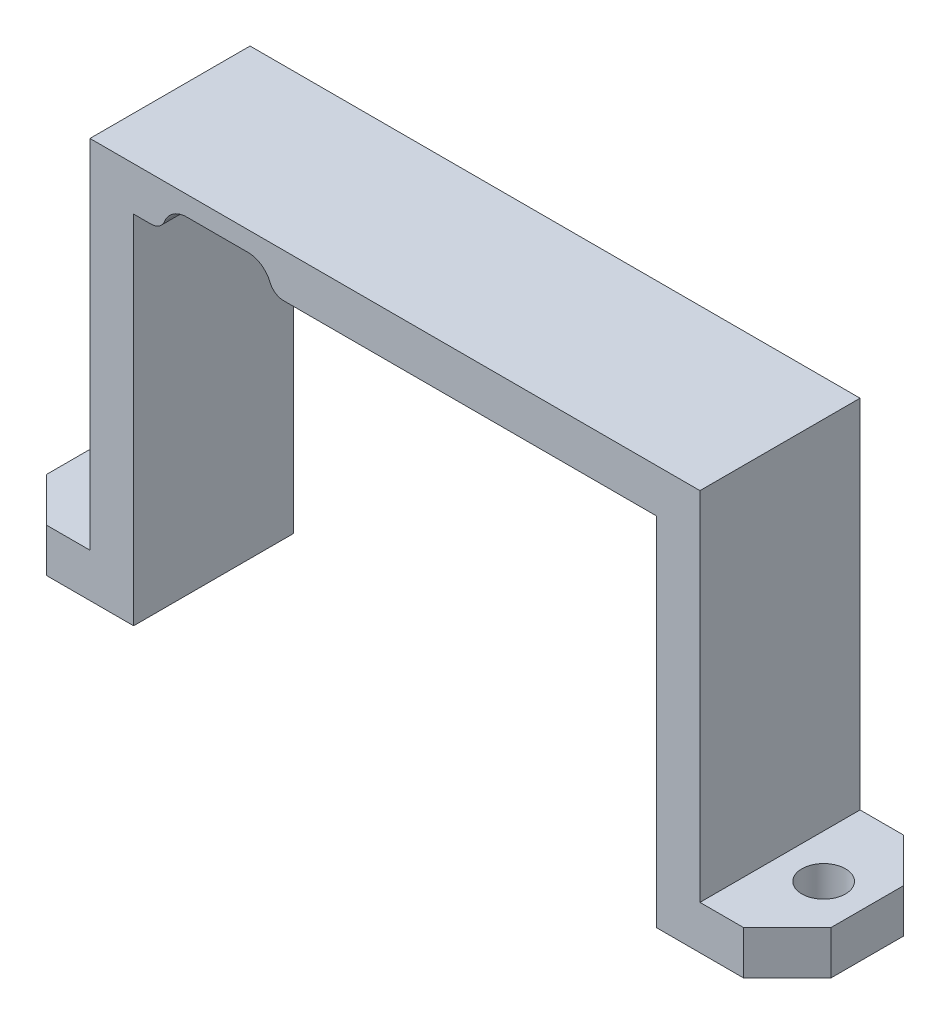
ISO-10303-21;
HEADER;
FILE_DESCRIPTION(('STEP AP214'),'2;1');
FILE_NAME('part.step','',(''),(''),'','','');
FILE_SCHEMA(('AUTOMOTIVE_DESIGN { 1 0 10303 214 1 1 1 1 }'));
ENDSEC;
DATA;
#1=APPLICATION_CONTEXT('core data for automotive mechanical design processes');
#2=APPLICATION_PROTOCOL_DEFINITION('international standard','automotive_design',2000,#1);
#3=PRODUCT_CONTEXT('',#1,'mechanical');
#4=PRODUCT('Part','Part','',(#3));
#5=PRODUCT_RELATED_PRODUCT_CATEGORY('part','',(#4));
#6=PRODUCT_DEFINITION_FORMATION('','',#4);
#7=PRODUCT_DEFINITION_CONTEXT('part definition',#1,'design');
#8=PRODUCT_DEFINITION('design','',#6,#7);
#9=PRODUCT_DEFINITION_SHAPE('','',#8);
#10=(LENGTH_UNIT() NAMED_UNIT(*) SI_UNIT(.MILLI.,.METRE.));
#11=(NAMED_UNIT(*) PLANE_ANGLE_UNIT() SI_UNIT($,.RADIAN.));
#12=(NAMED_UNIT(*) SI_UNIT($,.STERADIAN.) SOLID_ANGLE_UNIT());
#13=UNCERTAINTY_MEASURE_WITH_UNIT(LENGTH_MEASURE(1.E-05),#10,'distance_accuracy_value','');
#14=(GEOMETRIC_REPRESENTATION_CONTEXT(3) GLOBAL_UNCERTAINTY_ASSIGNED_CONTEXT((#13)) GLOBAL_UNIT_ASSIGNED_CONTEXT((#10,
#11,#12)) REPRESENTATION_CONTEXT('',''));
#15=CARTESIAN_POINT('',(0.,0.,0.));
#16=DIRECTION('',(0.,0.,1.));
#17=DIRECTION('',(1.,0.,0.));
#18=AXIS2_PLACEMENT_3D('',#15,#16,#17);
#19=CARTESIAN_POINT('',(-17.955,24.5,11.));
#20=DIRECTION('',(0.,1.,0.));
#21=DIRECTION('',(0.,0.,1.));
#22=AXIS2_PLACEMENT_3D('',#19,#20,#21);
#23=PLANE('',#22);
#24=DIRECTION('',(1.,0.,0.));
#25=VECTOR('',#24,1.);
#26=CARTESIAN_POINT('',(-17.955,24.5,0.));
#27=LINE('',#26,#25);
#28=CARTESIAN_POINT('',(-17.955,24.5,0.));
#29=VERTEX_POINT('',#28);
#30=CARTESIAN_POINT('',(-16.7590782383616,24.5,0.));
#31=VERTEX_POINT('',#30);
#32=EDGE_CURVE('E270',#29,#31,#27,.T.);
#33=ORIENTED_EDGE('',*,*,#32,.T.);
#34=DIRECTION('',(0.,0.,1.));
#35=VECTOR('',#34,1.);
#36=CARTESIAN_POINT('',(-16.7590782383616,24.5,11.));
#37=LINE('',#36,#35);
#38=CARTESIAN_POINT('',(-16.7590782383616,24.5,11.));
#39=VERTEX_POINT('',#38);
#40=EDGE_CURVE('E47',#31,#39,#37,.T.);
#41=ORIENTED_EDGE('',*,*,#40,.T.);
#42=DIRECTION('',(1.,0.,0.));
#43=VECTOR('',#42,1.);
#44=CARTESIAN_POINT('',(-17.955,24.5,11.));
#45=LINE('',#44,#43);
#46=CARTESIAN_POINT('',(-17.955,24.5,11.));
#47=VERTEX_POINT('',#46);
#48=EDGE_CURVE('E244',#47,#39,#45,.T.);
#49=ORIENTED_EDGE('',*,*,#48,.F.);
#50=DIRECTION('',(0.,0.,-1.));
#51=VECTOR('',#50,1.);
#52=CARTESIAN_POINT('',(-17.955,24.5,11.));
#53=LINE('',#52,#51);
#54=EDGE_CURVE('E317',#47,#29,#53,.T.);
#55=ORIENTED_EDGE('',*,*,#54,.T.);
#56=EDGE_LOOP('',(#33,#41,#49,#55));
#57=FACE_BOUND('',#56,.T.);
#58=ADVANCED_FACE('F41',(#57),#23,.F.);
#59=CARTESIAN_POINT('',(0.,0.,11.));
#60=DIRECTION('',(0.,0.,-1.));
#61=DIRECTION('',(-1.,0.,0.));
#62=AXIS2_PLACEMENT_3D('',#59,#60,#61);
#63=PLANE('',#62);
#64=CARTESIAN_POINT('',(-10.105,24.5,11.));
#65=DIRECTION('',(0.,0.,1.));
#66=DIRECTION('',(1.,0.,0.));
#67=AXIS2_PLACEMENT_3D('',#64,#65,#66);
#68=CIRCLE('',#67,1.65);
#69=CARTESIAN_POINT('',(-8.5769890213975,25.122641509434,11.));
#70=VERTEX_POINT('',#69);
#71=CARTESIAN_POINT('',(-10.105,26.15,11.));
#72=VERTEX_POINT('',#71);
#73=EDGE_CURVE('E210',#70,#72,#68,.T.);
#74=ORIENTED_EDGE('',*,*,#73,.F.);
#75=CARTESIAN_POINT('',(-7.6509217616384,25.5,11.));
#76=DIRECTION('',(0.,0.,-1.));
#77=DIRECTION('',(-1.,0.,0.));
#78=AXIS2_PLACEMENT_3D('',#75,#76,#77);
#79=CIRCLE('',#78,1.);
#80=CARTESIAN_POINT('',(-7.6509217616384,24.5,11.));
#81=VERTEX_POINT('',#80);
#82=EDGE_CURVE('E364',#70,#81,#79,.F.);
#83=ORIENTED_EDGE('',*,*,#82,.T.);
#84=CARTESIAN_POINT('',(17.955,24.5,11.));
#85=VERTEX_POINT('',#84);
#86=EDGE_CURVE('E241',#81,#85,#45,.T.);
#87=ORIENTED_EDGE('',*,*,#86,.T.);
#88=DIRECTION('',(0.,-1.,0.));
#89=VECTOR('',#88,1.);
#90=CARTESIAN_POINT('',(17.955,0.,11.));
#91=LINE('',#90,#89);
#92=CARTESIAN_POINT('',(17.955,0.,11.));
#93=VERTEX_POINT('',#92);
#94=EDGE_CURVE('E245',#85,#93,#91,.T.);
#95=ORIENTED_EDGE('',*,*,#94,.T.);
#96=DIRECTION('',(1.,0.,0.));
#97=VECTOR('',#96,1.);
#98=CARTESIAN_POINT('',(26.955,0.,11.));
#99=LINE('',#98,#97);
#100=CARTESIAN_POINT('',(23.955,0.,11.));
#101=VERTEX_POINT('',#100);
#102=EDGE_CURVE('E250',#93,#101,#99,.T.);
#103=ORIENTED_EDGE('',*,*,#102,.T.);
#104=DIRECTION('',(0.,1.,0.));
#105=VECTOR('',#104,1.);
#106=CARTESIAN_POINT('',(23.955,0.,11.));
#107=LINE('',#106,#105);
#108=CARTESIAN_POINT('',(23.955,3.,11.));
#109=VERTEX_POINT('',#108);
#110=EDGE_CURVE('E345',#101,#109,#107,.T.);
#111=ORIENTED_EDGE('',*,*,#110,.T.);
#112=DIRECTION('',(-1.,0.,0.));
#113=VECTOR('',#112,1.);
#114=CARTESIAN_POINT('',(20.955,3.,11.));
#115=LINE('',#114,#113);
#116=CARTESIAN_POINT('',(20.955,3.,11.));
#117=VERTEX_POINT('',#116);
#118=EDGE_CURVE('E246',#109,#117,#115,.T.);
#119=ORIENTED_EDGE('',*,*,#118,.T.);
#120=DIRECTION('',(0.,1.,0.));
#121=VECTOR('',#120,1.);
#122=CARTESIAN_POINT('',(20.955,27.5,11.));
#123=LINE('',#122,#121);
#124=CARTESIAN_POINT('',(20.955,27.5,11.));
#125=VERTEX_POINT('',#124);
#126=EDGE_CURVE('E252',#117,#125,#123,.T.);
#127=ORIENTED_EDGE('',*,*,#126,.T.);
#128=DIRECTION('',(-1.,0.,0.));
#129=VECTOR('',#128,1.);
#130=CARTESIAN_POINT('',(20.955,27.5,11.));
#131=LINE('',#130,#129);
#132=CARTESIAN_POINT('',(-20.955,27.5,11.));
#133=VERTEX_POINT('',#132);
#134=EDGE_CURVE('E255',#125,#133,#131,.T.);
#135=ORIENTED_EDGE('',*,*,#134,.T.);
#136=DIRECTION('',(0.,-1.,0.));
#137=VECTOR('',#136,1.);
#138=CARTESIAN_POINT('',(-20.955,27.5,11.));
#139=LINE('',#138,#137);
#140=CARTESIAN_POINT('',(-20.955,3.,11.));
#141=VERTEX_POINT('',#140);
#142=EDGE_CURVE('E258',#133,#141,#139,.T.);
#143=ORIENTED_EDGE('',*,*,#142,.T.);
#144=DIRECTION('',(-1.,0.,0.));
#145=VECTOR('',#144,1.);
#146=CARTESIAN_POINT('',(-20.955,3.,11.));
#147=LINE('',#146,#145);
#148=CARTESIAN_POINT('',(-23.955,3.,11.));
#149=VERTEX_POINT('',#148);
#150=EDGE_CURVE('E256',#141,#149,#147,.T.);
#151=ORIENTED_EDGE('',*,*,#150,.T.);
#152=DIRECTION('',(0.,-1.,0.));
#153=VECTOR('',#152,1.);
#154=CARTESIAN_POINT('',(-23.955,0.,11.));
#155=LINE('',#154,#153);
#156=CARTESIAN_POINT('',(-23.955,0.,11.));
#157=VERTEX_POINT('',#156);
#158=EDGE_CURVE('E338',#149,#157,#155,.T.);
#159=ORIENTED_EDGE('',*,*,#158,.T.);
#160=DIRECTION('',(1.,0.,0.));
#161=VECTOR('',#160,1.);
#162=CARTESIAN_POINT('',(-26.955,0.,11.));
#163=LINE('',#162,#161);
#164=CARTESIAN_POINT('',(-17.955,0.,11.));
#165=VERTEX_POINT('',#164);
#166=EDGE_CURVE('E261',#157,#165,#163,.T.);
#167=ORIENTED_EDGE('',*,*,#166,.T.);
#168=DIRECTION('',(0.,1.,0.));
#169=VECTOR('',#168,1.);
#170=CARTESIAN_POINT('',(-17.955,0.,11.));
#171=LINE('',#170,#169);
#172=EDGE_CURVE('E236',#165,#47,#171,.T.);
#173=ORIENTED_EDGE('',*,*,#172,.T.);
#174=ORIENTED_EDGE('',*,*,#48,.T.);
#175=CARTESIAN_POINT('',(-16.7590782383616,25.5,11.));
#176=DIRECTION('',(0.,0.,-1.));
#177=DIRECTION('',(-1.,0.,0.));
#178=AXIS2_PLACEMENT_3D('',#175,#176,#177);
#179=CIRCLE('',#178,1.);
#180=CARTESIAN_POINT('',(-15.8330109786025,25.122641509434,11.));
#181=VERTEX_POINT('',#180);
#182=EDGE_CURVE('E57',#39,#181,#179,.F.);
#183=ORIENTED_EDGE('',*,*,#182,.T.);
#184=CARTESIAN_POINT('',(-14.305,24.5,11.));
#185=DIRECTION('',(0.,0.,1.));
#186=DIRECTION('',(1.,0.,0.));
#187=AXIS2_PLACEMENT_3D('',#184,#185,#186);
#188=CIRCLE('',#187,1.65);
#189=CARTESIAN_POINT('',(-14.305,26.15,11.));
#190=VERTEX_POINT('',#189);
#191=EDGE_CURVE('E219',#190,#181,#188,.T.);
#192=ORIENTED_EDGE('',*,*,#191,.F.);
#193=DIRECTION('',(-1.,0.,0.));
#194=VECTOR('',#193,1.);
#195=CARTESIAN_POINT('',(-14.305,26.15,11.));
#196=LINE('',#195,#194);
#197=EDGE_CURVE('E220',#72,#190,#196,.T.);
#198=ORIENTED_EDGE('',*,*,#197,.F.);
#199=EDGE_LOOP('',(#74,#83,#87,#95,#103,#111,#119,#127,#135,#143,#151,#159,#167,#173,#174,#183,
#192,#198));
#200=FACE_BOUND('',#199,.T.);
#201=ADVANCED_FACE('F366',(#200),#63,.F.);
#202=CARTESIAN_POINT('',(0.,0.,0.));
#203=DIRECTION('',(0.,0.,-1.));
#204=DIRECTION('',(-1.,0.,0.));
#205=AXIS2_PLACEMENT_3D('',#202,#203,#204);
#206=PLANE('',#205);
#207=CARTESIAN_POINT('',(-7.6509217616384,24.5,0.));
#208=VERTEX_POINT('',#207);
#209=CARTESIAN_POINT('',(17.955,24.5,0.));
#210=VERTEX_POINT('',#209);
#211=EDGE_CURVE('E266',#208,#210,#27,.T.);
#212=ORIENTED_EDGE('',*,*,#211,.F.);
#213=CARTESIAN_POINT('',(-7.6509217616384,25.5,0.));
#214=DIRECTION('',(0.,0.,-1.));
#215=DIRECTION('',(-1.,0.,0.));
#216=AXIS2_PLACEMENT_3D('',#213,#214,#215);
#217=CIRCLE('',#216,1.);
#218=CARTESIAN_POINT('',(-8.5769890213975,25.122641509434,0.));
#219=VERTEX_POINT('',#218);
#220=EDGE_CURVE('E197',#208,#219,#217,.T.);
#221=ORIENTED_EDGE('',*,*,#220,.T.);
#222=CARTESIAN_POINT('',(-10.105,24.5,0.));
#223=DIRECTION('',(0.,0.,1.));
#224=DIRECTION('',(1.,0.,0.));
#225=AXIS2_PLACEMENT_3D('',#222,#223,#224);
#226=CIRCLE('',#225,1.65);
#227=CARTESIAN_POINT('',(-10.105,26.15,0.));
#228=VERTEX_POINT('',#227);
#229=EDGE_CURVE('E190',#219,#228,#226,.T.);
#230=ORIENTED_EDGE('',*,*,#229,.T.);
#231=DIRECTION('',(-1.,0.,0.));
#232=VECTOR('',#231,1.);
#233=CARTESIAN_POINT('',(-14.305,26.15,0.));
#234=LINE('',#233,#232);
#235=CARTESIAN_POINT('',(-14.305,26.15,0.));
#236=VERTEX_POINT('',#235);
#237=EDGE_CURVE('E198',#228,#236,#234,.T.);
#238=ORIENTED_EDGE('',*,*,#237,.T.);
#239=CARTESIAN_POINT('',(-14.305,24.5,0.));
#240=DIRECTION('',(0.,0.,1.));
#241=DIRECTION('',(1.,0.,0.));
#242=AXIS2_PLACEMENT_3D('',#239,#240,#241);
#243=CIRCLE('',#242,1.65);
#244=CARTESIAN_POINT('',(-15.8330109786025,25.122641509434,0.));
#245=VERTEX_POINT('',#244);
#246=EDGE_CURVE('E214',#236,#245,#243,.T.);
#247=ORIENTED_EDGE('',*,*,#246,.T.);
#248=CARTESIAN_POINT('',(-16.7590782383616,25.5,0.));
#249=DIRECTION('',(0.,0.,-1.));
#250=DIRECTION('',(-1.,0.,0.));
#251=AXIS2_PLACEMENT_3D('',#248,#249,#250);
#252=CIRCLE('',#251,1.);
#253=EDGE_CURVE('E359',#245,#31,#252,.T.);
#254=ORIENTED_EDGE('',*,*,#253,.T.);
#255=ORIENTED_EDGE('',*,*,#32,.F.);
#256=DIRECTION('',(0.,1.,0.));
#257=VECTOR('',#256,1.);
#258=CARTESIAN_POINT('',(-17.955,0.,0.));
#259=LINE('',#258,#257);
#260=CARTESIAN_POINT('',(-17.955,0.,0.));
#261=VERTEX_POINT('',#260);
#262=EDGE_CURVE('E228',#261,#29,#259,.T.);
#263=ORIENTED_EDGE('',*,*,#262,.F.);
#264=DIRECTION('',(1.,0.,0.));
#265=VECTOR('',#264,1.);
#266=CARTESIAN_POINT('',(-26.955,0.,0.));
#267=LINE('',#266,#265);
#268=CARTESIAN_POINT('',(-23.955,0.,0.));
#269=VERTEX_POINT('',#268);
#270=EDGE_CURVE('E242',#269,#261,#267,.T.);
#271=ORIENTED_EDGE('',*,*,#270,.F.);
#272=DIRECTION('',(0.,1.,0.));
#273=VECTOR('',#272,1.);
#274=CARTESIAN_POINT('',(-23.955,3.,0.));
#275=LINE('',#274,#273);
#276=CARTESIAN_POINT('',(-23.955,3.,0.));
#277=VERTEX_POINT('',#276);
#278=EDGE_CURVE('E332',#269,#277,#275,.T.);
#279=ORIENTED_EDGE('',*,*,#278,.T.);
#280=DIRECTION('',(-1.,0.,0.));
#281=VECTOR('',#280,1.);
#282=CARTESIAN_POINT('',(-20.955,3.,0.));
#283=LINE('',#282,#281);
#284=CARTESIAN_POINT('',(-20.955,3.,0.));
#285=VERTEX_POINT('',#284);
#286=EDGE_CURVE('E284',#285,#277,#283,.T.);
#287=ORIENTED_EDGE('',*,*,#286,.F.);
#288=DIRECTION('',(0.,-1.,0.));
#289=VECTOR('',#288,1.);
#290=CARTESIAN_POINT('',(-20.955,27.5,0.));
#291=LINE('',#290,#289);
#292=CARTESIAN_POINT('',(-20.955,27.5,0.));
#293=VERTEX_POINT('',#292);
#294=EDGE_CURVE('E281',#293,#285,#291,.T.);
#295=ORIENTED_EDGE('',*,*,#294,.F.);
#296=DIRECTION('',(-1.,0.,0.));
#297=VECTOR('',#296,1.);
#298=CARTESIAN_POINT('',(20.955,27.5,0.));
#299=LINE('',#298,#297);
#300=CARTESIAN_POINT('',(20.955,27.5,0.));
#301=VERTEX_POINT('',#300);
#302=EDGE_CURVE('E276',#301,#293,#299,.T.);
#303=ORIENTED_EDGE('',*,*,#302,.F.);
#304=DIRECTION('',(0.,1.,0.));
#305=VECTOR('',#304,1.);
#306=CARTESIAN_POINT('',(20.955,27.5,0.));
#307=LINE('',#306,#305);
#308=CARTESIAN_POINT('',(20.955,3.,0.));
#309=VERTEX_POINT('',#308);
#310=EDGE_CURVE('E280',#309,#301,#307,.T.);
#311=ORIENTED_EDGE('',*,*,#310,.F.);
#312=DIRECTION('',(-1.,0.,0.));
#313=VECTOR('',#312,1.);
#314=CARTESIAN_POINT('',(20.955,3.,0.));
#315=LINE('',#314,#313);
#316=CARTESIAN_POINT('',(23.955,3.,0.));
#317=VERTEX_POINT('',#316);
#318=EDGE_CURVE('E274',#317,#309,#315,.T.);
#319=ORIENTED_EDGE('',*,*,#318,.F.);
#320=DIRECTION('',(0.,-1.,0.));
#321=VECTOR('',#320,1.);
#322=CARTESIAN_POINT('',(23.955,0.,0.));
#323=LINE('',#322,#321);
#324=CARTESIAN_POINT('',(23.955,0.,0.));
#325=VERTEX_POINT('',#324);
#326=EDGE_CURVE('E334',#317,#325,#323,.T.);
#327=ORIENTED_EDGE('',*,*,#326,.T.);
#328=DIRECTION('',(1.,0.,0.));
#329=VECTOR('',#328,1.);
#330=CARTESIAN_POINT('',(26.955,0.,0.));
#331=LINE('',#330,#329);
#332=CARTESIAN_POINT('',(17.955,0.,0.));
#333=VERTEX_POINT('',#332);
#334=EDGE_CURVE('E275',#333,#325,#331,.T.);
#335=ORIENTED_EDGE('',*,*,#334,.F.);
#336=DIRECTION('',(0.,-1.,0.));
#337=VECTOR('',#336,1.);
#338=CARTESIAN_POINT('',(17.955,0.,0.));
#339=LINE('',#338,#337);
#340=EDGE_CURVE('E269',#210,#333,#339,.T.);
#341=ORIENTED_EDGE('',*,*,#340,.F.);
#342=EDGE_LOOP('',(#212,#221,#230,#238,#247,#254,#255,#263,#271,#279,#287,#295,#303,#311,#319,
#327,#335,#341));
#343=FACE_BOUND('',#342,.T.);
#344=ADVANCED_FACE('F193',(#343),#206,.T.);
#345=CARTESIAN_POINT('',(-17.955,0.,11.));
#346=DIRECTION('',(-1.,0.,0.));
#347=DIRECTION('',(0.,-1.,0.));
#348=AXIS2_PLACEMENT_3D('',#345,#346,#347);
#349=PLANE('',#348);
#350=ORIENTED_EDGE('',*,*,#262,.T.);
#351=ORIENTED_EDGE('',*,*,#54,.F.);
#352=ORIENTED_EDGE('',*,*,#172,.F.);
#353=DIRECTION('',(0.,0.,-1.));
#354=VECTOR('',#353,1.);
#355=CARTESIAN_POINT('',(-17.955,0.,11.));
#356=LINE('',#355,#354);
#357=EDGE_CURVE('E263',#165,#261,#356,.T.);
#358=ORIENTED_EDGE('',*,*,#357,.T.);
#359=EDGE_LOOP('',(#350,#351,#352,#358));
#360=FACE_BOUND('',#359,.T.);
#361=ADVANCED_FACE('F372',(#360),#349,.F.);
#362=ORIENTED_EDGE('',*,*,#86,.F.);
#363=DIRECTION('',(0.,0.,1.));
#364=VECTOR('',#363,1.);
#365=CARTESIAN_POINT('',(-7.6509217616384,24.5,11.));
#366=LINE('',#365,#364);
#367=EDGE_CURVE('E199',#81,#208,#366,.F.);
#368=ORIENTED_EDGE('',*,*,#367,.T.);
#369=ORIENTED_EDGE('',*,*,#211,.T.);
#370=DIRECTION('',(0.,0.,-1.));
#371=VECTOR('',#370,1.);
#372=CARTESIAN_POINT('',(17.955,24.5,11.));
#373=LINE('',#372,#371);
#374=EDGE_CURVE('E316',#85,#210,#373,.T.);
#375=ORIENTED_EDGE('',*,*,#374,.F.);
#376=EDGE_LOOP('',(#362,#368,#369,#375));
#377=FACE_BOUND('',#376,.T.);
#378=ADVANCED_FACE('F387',(#377),#23,.F.);
#379=CARTESIAN_POINT('',(17.955,0.,11.));
#380=DIRECTION('',(1.,0.,0.));
#381=DIRECTION('',(0.,1.,0.));
#382=AXIS2_PLACEMENT_3D('',#379,#380,#381);
#383=PLANE('',#382);
#384=ORIENTED_EDGE('',*,*,#340,.T.);
#385=DIRECTION('',(0.,0.,-1.));
#386=VECTOR('',#385,1.);
#387=CARTESIAN_POINT('',(17.955,0.,11.));
#388=LINE('',#387,#386);
#389=EDGE_CURVE('E311',#93,#333,#388,.T.);
#390=ORIENTED_EDGE('',*,*,#389,.F.);
#391=ORIENTED_EDGE('',*,*,#94,.F.);
#392=ORIENTED_EDGE('',*,*,#374,.T.);
#393=EDGE_LOOP('',(#384,#390,#391,#392));
#394=FACE_BOUND('',#393,.T.);
#395=ADVANCED_FACE('F392',(#394),#383,.F.);
#396=CARTESIAN_POINT('',(26.955,0.,11.));
#397=DIRECTION('',(0.,1.,0.));
#398=DIRECTION('',(0.,0.,1.));
#399=AXIS2_PLACEMENT_3D('',#396,#397,#398);
#400=PLANE('',#399);
#401=CARTESIAN_POINT('',(23.955,0.,5.5));
#402=DIRECTION('',(0.,1.,0.));
#403=DIRECTION('',(1.,0.,0.));
#404=AXIS2_PLACEMENT_3D('',#401,#402,#403);
#405=CIRCLE('',#404,1.5);
#406=CARTESIAN_POINT('',(25.455,0.,5.5));
#407=VERTEX_POINT('',#406);
#408=EDGE_CURVE('E221',#407,#407,#405,.T.);
#409=ORIENTED_EDGE('',*,*,#408,.T.);
#410=EDGE_LOOP('',(#409));
#411=FACE_BOUND('',#410,.T.);
#412=ORIENTED_EDGE('',*,*,#334,.T.);
#413=DIRECTION('',(0.707106781186548,0.,0.707106781186547));
#414=VECTOR('',#413,1.);
#415=CARTESIAN_POINT('',(26.955,0.,3.));
#416=LINE('',#415,#414);
#417=CARTESIAN_POINT('',(26.955,0.,3.));
#418=VERTEX_POINT('',#417);
#419=EDGE_CURVE('E337',#325,#418,#416,.T.);
#420=ORIENTED_EDGE('',*,*,#419,.T.);
#421=DIRECTION('',(0.,0.,-1.));
#422=VECTOR('',#421,1.);
#423=CARTESIAN_POINT('',(26.955,0.,11.));
#424=LINE('',#423,#422);
#425=CARTESIAN_POINT('',(26.955,0.,7.99999999999999));
#426=VERTEX_POINT('',#425);
#427=EDGE_CURVE('E309',#426,#418,#424,.T.);
#428=ORIENTED_EDGE('',*,*,#427,.F.);
#429=DIRECTION('',(0.707106781186547,0.,-0.707106781186548));
#430=VECTOR('',#429,1.);
#431=CARTESIAN_POINT('',(23.955,0.,11.));
#432=LINE('',#431,#430);
#433=EDGE_CURVE('E333',#426,#101,#432,.F.);
#434=ORIENTED_EDGE('',*,*,#433,.T.);
#435=ORIENTED_EDGE('',*,*,#102,.F.);
#436=ORIENTED_EDGE('',*,*,#389,.T.);
#437=EDGE_LOOP('',(#412,#420,#428,#434,#435,#436));
#438=FACE_BOUND('',#437,.T.);
#439=ADVANCED_FACE('F397',(#411,#438),#400,.F.);
#440=CARTESIAN_POINT('',(26.955,3.,11.));
#441=DIRECTION('',(-1.,0.,0.));
#442=DIRECTION('',(0.,0.,1.));
#443=AXIS2_PLACEMENT_3D('',#440,#441,#442);
#444=PLANE('',#443);
#445=ORIENTED_EDGE('',*,*,#427,.T.);
#446=DIRECTION('',(0.,1.,0.));
#447=VECTOR('',#446,1.);
#448=CARTESIAN_POINT('',(26.955,3.,3.));
#449=LINE('',#448,#447);
#450=CARTESIAN_POINT('',(26.955,3.,3.));
#451=VERTEX_POINT('',#450);
#452=EDGE_CURVE('E322',#418,#451,#449,.T.);
#453=ORIENTED_EDGE('',*,*,#452,.T.);
#454=DIRECTION('',(0.,0.,-1.));
#455=VECTOR('',#454,1.);
#456=CARTESIAN_POINT('',(26.955,3.,11.));
#457=LINE('',#456,#455);
#458=CARTESIAN_POINT('',(26.955,3.,7.99999999999999));
#459=VERTEX_POINT('',#458);
#460=EDGE_CURVE('E307',#459,#451,#457,.T.);
#461=ORIENTED_EDGE('',*,*,#460,.F.);
#462=DIRECTION('',(0.,-1.,0.));
#463=VECTOR('',#462,1.);
#464=CARTESIAN_POINT('',(26.955,3.,7.99999999999999));
#465=LINE('',#464,#463);
#466=EDGE_CURVE('E325',#459,#426,#465,.T.);
#467=ORIENTED_EDGE('',*,*,#466,.T.);
#468=EDGE_LOOP('',(#445,#453,#461,#467));
#469=FACE_BOUND('',#468,.T.);
#470=ADVANCED_FACE('F410',(#469),#444,.F.);
#471=CARTESIAN_POINT('',(20.955,3.,11.));
#472=DIRECTION('',(0.,-1.,0.));
#473=DIRECTION('',(1.,0.,0.));
#474=AXIS2_PLACEMENT_3D('',#471,#472,#473);
#475=PLANE('',#474);
#476=CARTESIAN_POINT('',(23.955,3.,5.5));
#477=DIRECTION('',(0.,1.,0.));
#478=DIRECTION('',(1.,0.,0.));
#479=AXIS2_PLACEMENT_3D('',#476,#477,#478);
#480=CIRCLE('',#479,1.5);
#481=CARTESIAN_POINT('',(25.455,3.,5.5));
#482=VERTEX_POINT('',#481);
#483=EDGE_CURVE('E233',#482,#482,#480,.T.);
#484=ORIENTED_EDGE('',*,*,#483,.F.);
#485=EDGE_LOOP('',(#484));
#486=FACE_BOUND('',#485,.T.);
#487=ORIENTED_EDGE('',*,*,#460,.T.);
#488=DIRECTION('',(-0.707106781186548,0.,-0.707106781186547));
#489=VECTOR('',#488,1.);
#490=CARTESIAN_POINT('',(26.955,3.,3.));
#491=LINE('',#490,#489);
#492=EDGE_CURVE('E328',#451,#317,#491,.T.);
#493=ORIENTED_EDGE('',*,*,#492,.T.);
#494=ORIENTED_EDGE('',*,*,#318,.T.);
#495=DIRECTION('',(0.,0.,-1.));
#496=VECTOR('',#495,1.);
#497=CARTESIAN_POINT('',(20.955,3.,11.));
#498=LINE('',#497,#496);
#499=EDGE_CURVE('E304',#117,#309,#498,.T.);
#500=ORIENTED_EDGE('',*,*,#499,.F.);
#501=ORIENTED_EDGE('',*,*,#118,.F.);
#502=DIRECTION('',(-0.707106781186547,0.,0.707106781186548));
#503=VECTOR('',#502,1.);
#504=CARTESIAN_POINT('',(23.955,3.,11.));
#505=LINE('',#504,#503);
#506=EDGE_CURVE('E330',#109,#459,#505,.F.);
#507=ORIENTED_EDGE('',*,*,#506,.T.);
#508=EDGE_LOOP('',(#487,#493,#494,#500,#501,#507));
#509=FACE_BOUND('',#508,.T.);
#510=ADVANCED_FACE('F407',(#486,#509),#475,.F.);
#511=CARTESIAN_POINT('',(20.955,27.5,11.));
#512=DIRECTION('',(-1.,0.,0.));
#513=DIRECTION('',(0.,-1.,0.));
#514=AXIS2_PLACEMENT_3D('',#511,#512,#513);
#515=PLANE('',#514);
#516=ORIENTED_EDGE('',*,*,#310,.T.);
#517=DIRECTION('',(0.,0.,-1.));
#518=VECTOR('',#517,1.);
#519=CARTESIAN_POINT('',(20.955,27.5,11.));
#520=LINE('',#519,#518);
#521=EDGE_CURVE('E302',#125,#301,#520,.T.);
#522=ORIENTED_EDGE('',*,*,#521,.F.);
#523=ORIENTED_EDGE('',*,*,#126,.F.);
#524=ORIENTED_EDGE('',*,*,#499,.T.);
#525=EDGE_LOOP('',(#516,#522,#523,#524));
#526=FACE_BOUND('',#525,.T.);
#527=ADVANCED_FACE('F423',(#526),#515,.F.);
#528=CARTESIAN_POINT('',(20.955,27.5,11.));
#529=DIRECTION('',(0.,-1.,0.));
#530=DIRECTION('',(0.,0.,-1.));
#531=AXIS2_PLACEMENT_3D('',#528,#529,#530);
#532=PLANE('',#531);
#533=ORIENTED_EDGE('',*,*,#302,.T.);
#534=DIRECTION('',(0.,0.,-1.));
#535=VECTOR('',#534,1.);
#536=CARTESIAN_POINT('',(-20.955,27.5,11.));
#537=LINE('',#536,#535);
#538=EDGE_CURVE('E299',#133,#293,#537,.T.);
#539=ORIENTED_EDGE('',*,*,#538,.F.);
#540=ORIENTED_EDGE('',*,*,#134,.F.);
#541=ORIENTED_EDGE('',*,*,#521,.T.);
#542=EDGE_LOOP('',(#533,#539,#540,#541));
#543=FACE_BOUND('',#542,.T.);
#544=ADVANCED_FACE('F422',(#543),#532,.F.);
#545=CARTESIAN_POINT('',(-20.955,27.5,11.));
#546=DIRECTION('',(1.,0.,0.));
#547=DIRECTION('',(0.,1.,0.));
#548=AXIS2_PLACEMENT_3D('',#545,#546,#547);
#549=PLANE('',#548);
#550=ORIENTED_EDGE('',*,*,#294,.T.);
#551=DIRECTION('',(0.,0.,-1.));
#552=VECTOR('',#551,1.);
#553=CARTESIAN_POINT('',(-20.955,3.,11.));
#554=LINE('',#553,#552);
#555=EDGE_CURVE('E293',#141,#285,#554,.T.);
#556=ORIENTED_EDGE('',*,*,#555,.F.);
#557=ORIENTED_EDGE('',*,*,#142,.F.);
#558=ORIENTED_EDGE('',*,*,#538,.T.);
#559=EDGE_LOOP('',(#550,#556,#557,#558));
#560=FACE_BOUND('',#559,.T.);
#561=ADVANCED_FACE('F435',(#560),#549,.F.);
#562=CARTESIAN_POINT('',(-20.955,3.,11.));
#563=DIRECTION('',(0.,-1.,0.));
#564=DIRECTION('',(1.,0.,0.));
#565=AXIS2_PLACEMENT_3D('',#562,#563,#564);
#566=PLANE('',#565);
#567=CARTESIAN_POINT('',(-23.955,3.,5.5));
#568=DIRECTION('',(0.,1.,0.));
#569=DIRECTION('',(-1.,0.,0.));
#570=AXIS2_PLACEMENT_3D('',#567,#568,#569);
#571=CIRCLE('',#570,1.5);
#572=CARTESIAN_POINT('',(-25.455,3.,5.5));
#573=VERTEX_POINT('',#572);
#574=EDGE_CURVE('E230',#573,#573,#571,.T.);
#575=ORIENTED_EDGE('',*,*,#574,.F.);
#576=EDGE_LOOP('',(#575));
#577=FACE_BOUND('',#576,.T.);
#578=ORIENTED_EDGE('',*,*,#286,.T.);
#579=DIRECTION('',(-0.707106781186548,0.,0.707106781186547));
#580=VECTOR('',#579,1.);
#581=CARTESIAN_POINT('',(-26.955,3.,3.));
#582=LINE('',#581,#580);
#583=CARTESIAN_POINT('',(-26.955,3.,3.));
#584=VERTEX_POINT('',#583);
#585=EDGE_CURVE('E203',#277,#584,#582,.T.);
#586=ORIENTED_EDGE('',*,*,#585,.T.);
#587=DIRECTION('',(0.,0.,-1.));
#588=VECTOR('',#587,1.);
#589=CARTESIAN_POINT('',(-26.955,3.,11.));
#590=LINE('',#589,#588);
#591=CARTESIAN_POINT('',(-26.955,3.,7.99999999999999));
#592=VERTEX_POINT('',#591);
#593=EDGE_CURVE('E295',#592,#584,#590,.T.);
#594=ORIENTED_EDGE('',*,*,#593,.F.);
#595=DIRECTION('',(-0.707106781186547,0.,-0.707106781186548));
#596=VECTOR('',#595,1.);
#597=CARTESIAN_POINT('',(-23.955,3.,11.));
#598=LINE('',#597,#596);
#599=EDGE_CURVE('E353',#592,#149,#598,.F.);
#600=ORIENTED_EDGE('',*,*,#599,.T.);
#601=ORIENTED_EDGE('',*,*,#150,.F.);
#602=ORIENTED_EDGE('',*,*,#555,.T.);
#603=EDGE_LOOP('',(#578,#586,#594,#600,#601,#602));
#604=FACE_BOUND('',#603,.T.);
#605=ADVANCED_FACE('F434',(#577,#604),#566,.F.);
#606=CARTESIAN_POINT('',(-26.955,3.,11.));
#607=DIRECTION('',(1.,0.,0.));
#608=DIRECTION('',(0.,0.,-1.));
#609=AXIS2_PLACEMENT_3D('',#606,#607,#608);
#610=PLANE('',#609);
#611=ORIENTED_EDGE('',*,*,#593,.T.);
#612=DIRECTION('',(0.,-1.,0.));
#613=VECTOR('',#612,1.);
#614=CARTESIAN_POINT('',(-26.955,0.,3.));
#615=LINE('',#614,#613);
#616=CARTESIAN_POINT('',(-26.955,0.,3.));
#617=VERTEX_POINT('',#616);
#618=EDGE_CURVE('E350',#584,#617,#615,.T.);
#619=ORIENTED_EDGE('',*,*,#618,.T.);
#620=DIRECTION('',(0.,0.,-1.));
#621=VECTOR('',#620,1.);
#622=CARTESIAN_POINT('',(-26.955,0.,11.));
#623=LINE('',#622,#621);
#624=CARTESIAN_POINT('',(-26.955,0.,7.99999999999999));
#625=VERTEX_POINT('',#624);
#626=EDGE_CURVE('E289',#625,#617,#623,.T.);
#627=ORIENTED_EDGE('',*,*,#626,.F.);
#628=DIRECTION('',(0.,1.,0.));
#629=VECTOR('',#628,1.);
#630=CARTESIAN_POINT('',(-26.955,3.,7.99999999999999));
#631=LINE('',#630,#629);
#632=EDGE_CURVE('E341',#625,#592,#631,.T.);
#633=ORIENTED_EDGE('',*,*,#632,.T.);
#634=EDGE_LOOP('',(#611,#619,#627,#633));
#635=FACE_BOUND('',#634,.T.);
#636=ADVANCED_FACE('F448',(#635),#610,.F.);
#637=CARTESIAN_POINT('',(-26.955,0.,11.));
#638=DIRECTION('',(0.,1.,0.));
#639=DIRECTION('',(0.,0.,1.));
#640=AXIS2_PLACEMENT_3D('',#637,#638,#639);
#641=PLANE('',#640);
#642=CARTESIAN_POINT('',(-23.955,0.,5.5));
#643=DIRECTION('',(0.,1.,0.));
#644=DIRECTION('',(-1.,0.,0.));
#645=AXIS2_PLACEMENT_3D('',#642,#643,#644);
#646=CIRCLE('',#645,1.5);
#647=CARTESIAN_POINT('',(-25.455,0.,5.5));
#648=VERTEX_POINT('',#647);
#649=EDGE_CURVE('E226',#648,#648,#646,.T.);
#650=ORIENTED_EDGE('',*,*,#649,.T.);
#651=EDGE_LOOP('',(#650));
#652=FACE_BOUND('',#651,.T.);
#653=ORIENTED_EDGE('',*,*,#626,.T.);
#654=DIRECTION('',(0.707106781186548,0.,-0.707106781186547));
#655=VECTOR('',#654,1.);
#656=CARTESIAN_POINT('',(-26.955,0.,3.));
#657=LINE('',#656,#655);
#658=EDGE_CURVE('E352',#617,#269,#657,.T.);
#659=ORIENTED_EDGE('',*,*,#658,.T.);
#660=ORIENTED_EDGE('',*,*,#270,.T.);
#661=ORIENTED_EDGE('',*,*,#357,.F.);
#662=ORIENTED_EDGE('',*,*,#166,.F.);
#663=DIRECTION('',(0.707106781186547,0.,0.707106781186548));
#664=VECTOR('',#663,1.);
#665=CARTESIAN_POINT('',(-23.955,0.,11.));
#666=LINE('',#665,#664);
#667=EDGE_CURVE('E348',#157,#625,#666,.F.);
#668=ORIENTED_EDGE('',*,*,#667,.T.);
#669=EDGE_LOOP('',(#653,#659,#660,#661,#662,#668));
#670=FACE_BOUND('',#669,.T.);
#671=ADVANCED_FACE('F445',(#652,#670),#641,.F.);
#672=CARTESIAN_POINT('',(26.955,3.,3.));
#673=DIRECTION('',(0.707106781186547,0.,-0.707106781186548));
#674=DIRECTION('',(0.,-1.,0.));
#675=AXIS2_PLACEMENT_3D('',#672,#673,#674);
#676=PLANE('',#675);
#677=ORIENTED_EDGE('',*,*,#419,.F.);
#678=ORIENTED_EDGE('',*,*,#326,.F.);
#679=ORIENTED_EDGE('',*,*,#492,.F.);
#680=ORIENTED_EDGE('',*,*,#452,.F.);
#681=EDGE_LOOP('',(#677,#678,#679,#680));
#682=FACE_BOUND('',#681,.T.);
#683=ADVANCED_FACE('F413',(#682),#676,.T.);
#684=CARTESIAN_POINT('',(23.955,0.,11.));
#685=DIRECTION('',(-0.707106781186548,0.,-0.707106781186547));
#686=DIRECTION('',(0.,1.,0.));
#687=AXIS2_PLACEMENT_3D('',#684,#685,#686);
#688=PLANE('',#687);
#689=ORIENTED_EDGE('',*,*,#433,.F.);
#690=ORIENTED_EDGE('',*,*,#466,.F.);
#691=ORIENTED_EDGE('',*,*,#506,.F.);
#692=ORIENTED_EDGE('',*,*,#110,.F.);
#693=EDGE_LOOP('',(#689,#690,#691,#692));
#694=FACE_BOUND('',#693,.T.);
#695=ADVANCED_FACE('F401',(#694),#688,.F.);
#696=CARTESIAN_POINT('',(-26.955,3.,3.));
#697=DIRECTION('',(-0.707106781186547,0.,-0.707106781186548));
#698=DIRECTION('',(0.,1.,0.));
#699=AXIS2_PLACEMENT_3D('',#696,#697,#698);
#700=PLANE('',#699);
#701=ORIENTED_EDGE('',*,*,#585,.F.);
#702=ORIENTED_EDGE('',*,*,#278,.F.);
#703=ORIENTED_EDGE('',*,*,#658,.F.);
#704=ORIENTED_EDGE('',*,*,#618,.F.);
#705=EDGE_LOOP('',(#701,#702,#703,#704));
#706=FACE_BOUND('',#705,.T.);
#707=ADVANCED_FACE('F447',(#706),#700,.T.);
#708=CARTESIAN_POINT('',(-23.955,0.,11.));
#709=DIRECTION('',(0.707106781186548,0.,-0.707106781186547));
#710=DIRECTION('',(0.,-1.,0.));
#711=AXIS2_PLACEMENT_3D('',#708,#709,#710);
#712=PLANE('',#711);
#713=ORIENTED_EDGE('',*,*,#599,.F.);
#714=ORIENTED_EDGE('',*,*,#632,.F.);
#715=ORIENTED_EDGE('',*,*,#667,.F.);
#716=ORIENTED_EDGE('',*,*,#158,.F.);
#717=EDGE_LOOP('',(#713,#714,#715,#716));
#718=FACE_BOUND('',#717,.T.);
#719=ADVANCED_FACE('F439',(#718),#712,.F.);
#720=CARTESIAN_POINT('',(-23.955,0.,5.5));
#721=DIRECTION('',(0.,1.,0.));
#722=DIRECTION('',(-1.,0.,0.));
#723=AXIS2_PLACEMENT_3D('',#720,#721,#722);
#724=CYLINDRICAL_SURFACE('',#723,1.5);
#725=ORIENTED_EDGE('',*,*,#649,.F.);
#726=EDGE_LOOP('',(#725));
#727=FACE_BOUND('',#726,.T.);
#728=ORIENTED_EDGE('',*,*,#574,.T.);
#729=EDGE_LOOP('',(#728));
#730=FACE_BOUND('',#729,.T.);
#731=ADVANCED_FACE('F498',(#727,#730),#724,.F.);
#732=CARTESIAN_POINT('',(23.955,0.,5.5));
#733=DIRECTION('',(0.,1.,0.));
#734=DIRECTION('',(-1.,0.,0.));
#735=AXIS2_PLACEMENT_3D('',#732,#733,#734);
#736=CYLINDRICAL_SURFACE('',#735,1.5);
#737=ORIENTED_EDGE('',*,*,#408,.F.);
#738=EDGE_LOOP('',(#737));
#739=FACE_BOUND('',#738,.T.);
#740=ORIENTED_EDGE('',*,*,#483,.T.);
#741=EDGE_LOOP('',(#740));
#742=FACE_BOUND('',#741,.T.);
#743=ADVANCED_FACE('F511',(#739,#742),#736,.F.);
#744=CARTESIAN_POINT('',(-14.305,24.5,0.));
#745=DIRECTION('',(0.,0.,1.));
#746=DIRECTION('',(1.,0.,0.));
#747=AXIS2_PLACEMENT_3D('',#744,#745,#746);
#748=CYLINDRICAL_SURFACE('',#747,1.65);
#749=ORIENTED_EDGE('',*,*,#191,.T.);
#750=DIRECTION('',(0.,0.,1.));
#751=VECTOR('',#750,1.);
#752=CARTESIAN_POINT('',(-15.8330109786025,25.122641509434,0.));
#753=LINE('',#752,#751);
#754=EDGE_CURVE('E11',#181,#245,#753,.F.);
#755=ORIENTED_EDGE('',*,*,#754,.T.);
#756=ORIENTED_EDGE('',*,*,#246,.F.);
#757=DIRECTION('',(0.,0.,1.));
#758=VECTOR('',#757,1.);
#759=CARTESIAN_POINT('',(-14.305,26.15,0.));
#760=LINE('',#759,#758);
#761=EDGE_CURVE('E211',#236,#190,#760,.T.);
#762=ORIENTED_EDGE('',*,*,#761,.T.);
#763=EDGE_LOOP('',(#749,#755,#756,#762));
#764=FACE_BOUND('',#763,.T.);
#765=ADVANCED_FACE('F377',(#764),#748,.F.);
#766=CARTESIAN_POINT('',(-10.105,24.5,0.));
#767=DIRECTION('',(0.,0.,1.));
#768=DIRECTION('',(1.,0.,0.));
#769=AXIS2_PLACEMENT_3D('',#766,#767,#768);
#770=CYLINDRICAL_SURFACE('',#769,1.65);
#771=ORIENTED_EDGE('',*,*,#229,.F.);
#772=DIRECTION('',(0.,0.,1.));
#773=VECTOR('',#772,1.);
#774=CARTESIAN_POINT('',(-8.5769890213975,25.122641509434,0.));
#775=LINE('',#774,#773);
#776=EDGE_CURVE('E362',#219,#70,#775,.T.);
#777=ORIENTED_EDGE('',*,*,#776,.T.);
#778=ORIENTED_EDGE('',*,*,#73,.T.);
#779=DIRECTION('',(0.,0.,1.));
#780=VECTOR('',#779,1.);
#781=CARTESIAN_POINT('',(-10.105,26.15,0.));
#782=LINE('',#781,#780);
#783=EDGE_CURVE('E204',#228,#72,#782,.T.);
#784=ORIENTED_EDGE('',*,*,#783,.F.);
#785=EDGE_LOOP('',(#771,#777,#778,#784));
#786=FACE_BOUND('',#785,.T.);
#787=ADVANCED_FACE('F202',(#786),#770,.F.);
#788=CARTESIAN_POINT('',(-14.305,26.15,0.));
#789=DIRECTION('',(0.,1.,0.));
#790=DIRECTION('',(0.,0.,1.));
#791=AXIS2_PLACEMENT_3D('',#788,#789,#790);
#792=PLANE('',#791);
#793=ORIENTED_EDGE('',*,*,#197,.T.);
#794=ORIENTED_EDGE('',*,*,#761,.F.);
#795=ORIENTED_EDGE('',*,*,#237,.F.);
#796=ORIENTED_EDGE('',*,*,#783,.T.);
#797=EDGE_LOOP('',(#793,#794,#795,#796));
#798=FACE_BOUND('',#797,.T.);
#799=ADVANCED_FACE('F212',(#798),#792,.F.);
#800=CARTESIAN_POINT('',(-7.6509217616384,25.5,0.));
#801=DIRECTION('',(0.,0.,1.));
#802=DIRECTION('',(1.,0.,0.));
#803=AXIS2_PLACEMENT_3D('',#800,#801,#802);
#804=CYLINDRICAL_SURFACE('',#803,1.);
#805=ORIENTED_EDGE('',*,*,#82,.F.);
#806=ORIENTED_EDGE('',*,*,#776,.F.);
#807=ORIENTED_EDGE('',*,*,#220,.F.);
#808=ORIENTED_EDGE('',*,*,#367,.F.);
#809=EDGE_LOOP('',(#805,#806,#807,#808));
#810=FACE_BOUND('',#809,.T.);
#811=ADVANCED_FACE('F383',(#810),#804,.T.);
#812=CARTESIAN_POINT('',(-16.7590782383616,25.5,0.));
#813=DIRECTION('',(0.,0.,1.));
#814=DIRECTION('',(1.,0.,0.));
#815=AXIS2_PLACEMENT_3D('',#812,#813,#814);
#816=CYLINDRICAL_SURFACE('',#815,1.);
#817=ORIENTED_EDGE('',*,*,#253,.F.);
#818=ORIENTED_EDGE('',*,*,#754,.F.);
#819=ORIENTED_EDGE('',*,*,#182,.F.);
#820=ORIENTED_EDGE('',*,*,#40,.F.);
#821=EDGE_LOOP('',(#817,#818,#819,#820));
#822=FACE_BOUND('',#821,.T.);
#823=ADVANCED_FACE('F43',(#822),#816,.T.);
#824=CLOSED_SHELL('',(#58,#201,#344,#361,#378,#395,#439,#470,#510,#527,#544,#561,#605,#636,#671,
#683,#695,#707,#719,#731,#743,#765,#787,#799,#811,#823));
#825=MANIFOLD_SOLID_BREP('B2',#824);
#826=ADVANCED_BREP_SHAPE_REPRESENTATION('',(#18,#825),#14);
#827=SHAPE_DEFINITION_REPRESENTATION(#9,#826);
ENDSEC;
END-ISO-10303-21;
